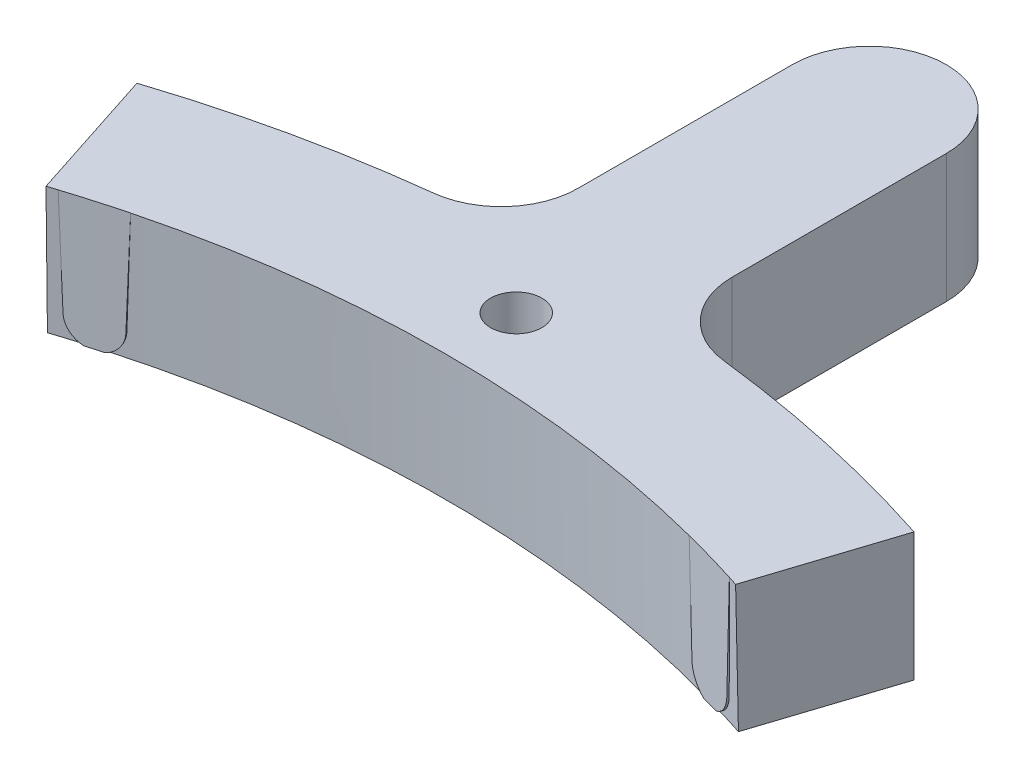
ISO-10303-21;
HEADER;
FILE_DESCRIPTION(('STEP AP214'),'2;1');
FILE_NAME('part.step','',(''),(''),'','','');
FILE_SCHEMA(('AUTOMOTIVE_DESIGN { 1 0 10303 214 1 1 1 1 }'));
ENDSEC;
DATA;
#1=APPLICATION_CONTEXT('core data for automotive mechanical design processes');
#2=APPLICATION_PROTOCOL_DEFINITION('international standard','automotive_design',2000,#1);
#3=PRODUCT_CONTEXT('',#1,'mechanical');
#4=PRODUCT('Part','Part','',(#3));
#5=PRODUCT_RELATED_PRODUCT_CATEGORY('part','',(#4));
#6=PRODUCT_DEFINITION_FORMATION('','',#4);
#7=PRODUCT_DEFINITION_CONTEXT('part definition',#1,'design');
#8=PRODUCT_DEFINITION('design','',#6,#7);
#9=PRODUCT_DEFINITION_SHAPE('','',#8);
#10=(LENGTH_UNIT() NAMED_UNIT(*) SI_UNIT(.MILLI.,.METRE.));
#11=(NAMED_UNIT(*) PLANE_ANGLE_UNIT() SI_UNIT($,.RADIAN.));
#12=(NAMED_UNIT(*) SI_UNIT($,.STERADIAN.) SOLID_ANGLE_UNIT());
#13=UNCERTAINTY_MEASURE_WITH_UNIT(LENGTH_MEASURE(1.E-05),#10,'distance_accuracy_value','');
#14=(GEOMETRIC_REPRESENTATION_CONTEXT(3) GLOBAL_UNCERTAINTY_ASSIGNED_CONTEXT((#13)) GLOBAL_UNIT_ASSIGNED_CONTEXT((#10,
#11,#12)) REPRESENTATION_CONTEXT('',''));
#15=CARTESIAN_POINT('',(0.,0.,0.));
#16=DIRECTION('',(0.,0.,1.));
#17=DIRECTION('',(1.,0.,0.));
#18=AXIS2_PLACEMENT_3D('',#15,#16,#17);
#19=CARTESIAN_POINT('',(0.,13.97,0.));
#20=DIRECTION('',(0.,-1.,0.));
#21=DIRECTION('',(0.,0.,-1.));
#22=AXIS2_PLACEMENT_3D('',#19,#20,#21);
#23=CYLINDRICAL_SURFACE('',#22,62.23);
#24=DIRECTION('',(0.,1.,0.));
#25=VECTOR('',#24,1.);
#26=CARTESIAN_POINT('',(-7.18038461538461,-15.5600139092241,-61.8143589853939));
#27=LINE('',#26,#25);
#28=CARTESIAN_POINT('',(-7.18038461538461,7.62,-61.8143589853939));
#29=VERTEX_POINT('',#28);
#30=CARTESIAN_POINT('',(-7.18038461538461,13.97,-61.8143589853939));
#31=VERTEX_POINT('',#30);
#32=EDGE_CURVE('E222',#29,#31,#27,.T.);
#33=ORIENTED_EDGE('',*,*,#32,.F.);
#34=CARTESIAN_POINT('',(0.,7.62,0.));
#35=DIRECTION('',(0.,1.,0.));
#36=DIRECTION('',(0.,0.,1.));
#37=AXIS2_PLACEMENT_3D('',#34,#35,#36);
#38=CIRCLE('',#37,62.23);
#39=CARTESIAN_POINT('',(-19.230127559953,7.61999999999723,-59.1842470090474));
#40=VERTEX_POINT('',#39);
#41=EDGE_CURVE('E346',#29,#40,#38,.T.);
#42=ORIENTED_EDGE('',*,*,#41,.T.);
#43=DIRECTION('',(0.,1.,0.));
#44=VECTOR('',#43,1.);
#45=CARTESIAN_POINT('',(-19.230127559953,7.61999999999723,-59.1842470090474));
#46=LINE('',#45,#44);
#47=CARTESIAN_POINT('',(-19.230127559953,13.97,-59.1842470090474));
#48=VERTEX_POINT('',#47);
#49=EDGE_CURVE('E235',#40,#48,#46,.T.);
#50=ORIENTED_EDGE('',*,*,#49,.T.);
#51=CARTESIAN_POINT('',(0.,13.97,0.));
#52=DIRECTION('',(0.,1.,0.));
#53=DIRECTION('',(0.,0.,1.));
#54=AXIS2_PLACEMENT_3D('',#51,#52,#53);
#55=CIRCLE('',#54,62.23);
#56=EDGE_CURVE('E64',#31,#48,#55,.T.);
#57=ORIENTED_EDGE('',*,*,#56,.F.);
#58=EDGE_LOOP('',(#33,#42,#50,#57));
#59=FACE_BOUND('',#58,.T.);
#60=ADVANCED_FACE('F41',(#59),#23,.T.);
#61=CARTESIAN_POINT('',(0.,13.97,0.));
#62=DIRECTION('',(0.,1.,0.));
#63=DIRECTION('',(0.,0.,1.));
#64=AXIS2_PLACEMENT_3D('',#61,#62,#63);
#65=PLANE('',#64);
#66=DIRECTION('',(-0.309016994374948,0.,0.951056516295153));
#67=VECTOR('',#66,1.);
#68=CARTESIAN_POINT('',(17.0643024179482,13.97,-52.518522625099));
#69=LINE('',#68,#67);
#70=CARTESIAN_POINT('',(19.2301275599531,13.97,-59.1842470090474));
#71=VERTEX_POINT('',#70);
#72=CARTESIAN_POINT('',(17.0643024179489,13.97,-52.5185226251009));
#73=VERTEX_POINT('',#72);
#74=EDGE_CURVE('E232',#71,#73,#69,.T.);
#75=ORIENTED_EDGE('',*,*,#74,.F.);
#76=CARTESIAN_POINT('',(7.1803846153846,13.97,-61.8143589853939));
#77=VERTEX_POINT('',#76);
#78=EDGE_CURVE('E348',#71,#77,#55,.T.);
#79=ORIENTED_EDGE('',*,*,#78,.T.);
#80=CARTESIAN_POINT('',(7.62,13.97,-65.5989115763364));
#81=DIRECTION('',(0.,-1.,0.));
#82=DIRECTION('',(0.,0.,-1.));
#83=AXIS2_PLACEMENT_3D('',#80,#81,#82);
#84=CIRCLE('',#83,3.81);
#85=CARTESIAN_POINT('',(3.81,13.97,-65.5989115763364));
#86=VERTEX_POINT('',#85);
#87=EDGE_CURVE('E212',#77,#86,#84,.T.);
#88=ORIENTED_EDGE('',*,*,#87,.T.);
#89=DIRECTION('',(0.,0.,-1.));
#90=VECTOR('',#89,1.);
#91=CARTESIAN_POINT('',(3.81,13.97,-65.5989115763364));
#92=LINE('',#91,#90);
#93=CARTESIAN_POINT('',(3.81,13.97,-76.2));
#94=VERTEX_POINT('',#93);
#95=EDGE_CURVE('E191',#86,#94,#92,.T.);
#96=ORIENTED_EDGE('',*,*,#95,.T.);
#97=CARTESIAN_POINT('',(0.,13.97,-76.2));
#98=DIRECTION('',(0.,1.,0.));
#99=DIRECTION('',(0.,0.,-1.));
#100=AXIS2_PLACEMENT_3D('',#97,#98,#99);
#101=CIRCLE('',#100,3.81);
#102=CARTESIAN_POINT('',(-3.81,13.97,-76.2));
#103=VERTEX_POINT('',#102);
#104=EDGE_CURVE('E185',#94,#103,#101,.T.);
#105=ORIENTED_EDGE('',*,*,#104,.T.);
#106=DIRECTION('',(0.,0.,1.));
#107=VECTOR('',#106,1.);
#108=CARTESIAN_POINT('',(-3.81,13.97,-65.5989115763364));
#109=LINE('',#108,#107);
#110=CARTESIAN_POINT('',(-3.81,13.97,-65.5989115763364));
#111=VERTEX_POINT('',#110);
#112=EDGE_CURVE('E194',#103,#111,#109,.T.);
#113=ORIENTED_EDGE('',*,*,#112,.T.);
#114=CARTESIAN_POINT('',(-7.62,13.97,-65.5989115763364));
#115=DIRECTION('',(0.,-1.,0.));
#116=DIRECTION('',(0.,0.,1.));
#117=AXIS2_PLACEMENT_3D('',#114,#115,#116);
#118=CIRCLE('',#117,3.81);
#119=EDGE_CURVE('E200',#111,#31,#118,.T.);
#120=ORIENTED_EDGE('',*,*,#119,.T.);
#121=ORIENTED_EDGE('',*,*,#56,.T.);
#122=DIRECTION('',(-0.309016994374949,0.,-0.951056516295153));
#123=VECTOR('',#122,1.);
#124=CARTESIAN_POINT('',(-17.0643024179482,13.97,-52.5185226250989));
#125=LINE('',#124,#123);
#126=CARTESIAN_POINT('',(-17.0643024179482,13.97,-52.5185226250989));
#127=VERTEX_POINT('',#126);
#128=EDGE_CURVE('E227',#127,#48,#125,.T.);
#129=ORIENTED_EDGE('',*,*,#128,.F.);
#130=CARTESIAN_POINT('',(0.,13.97,0.));
#131=DIRECTION('',(0.,1.,0.));
#132=DIRECTION('',(0.,0.,1.));
#133=AXIS2_PLACEMENT_3D('',#130,#131,#132);
#134=CIRCLE('',#133,55.2212426130964);
#135=CARTESIAN_POINT('',(-16.6079007781591,13.97,-52.664630137095));
#136=VERTEX_POINT('',#135);
#137=EDGE_CURVE('E344',#127,#136,#134,.F.);
#138=ORIENTED_EDGE('',*,*,#137,.T.);
#139=CARTESIAN_POINT('',(0.,13.97,0.));
#140=DIRECTION('',(0.,1.,0.));
#141=DIRECTION('',(0.,0.,1.));
#142=AXIS2_PLACEMENT_3D('',#139,#140,#141);
#143=CIRCLE('',#142,55.2212426130944);
#144=CARTESIAN_POINT('',(-13.8218889362057,13.97,-53.463455013396));
#145=VERTEX_POINT('',#144);
#146=EDGE_CURVE('E241',#145,#136,#143,.T.);
#147=ORIENTED_EDGE('',*,*,#146,.F.);
#148=CARTESIAN_POINT('',(13.8218889362064,13.97,-53.4634550133959));
#149=VERTEX_POINT('',#148);
#150=EDGE_CURVE('E347',#145,#149,#134,.F.);
#151=ORIENTED_EDGE('',*,*,#150,.T.);
#152=CARTESIAN_POINT('',(16.60790077816,13.97,-52.6646301370951));
#153=VERTEX_POINT('',#152);
#154=EDGE_CURVE('E247',#153,#149,#143,.T.);
#155=ORIENTED_EDGE('',*,*,#154,.F.);
#156=EDGE_CURVE('E340',#153,#73,#134,.F.);
#157=ORIENTED_EDGE('',*,*,#156,.T.);
#158=EDGE_LOOP('',(#75,#79,#88,#96,#105,#113,#120,#121,#129,#138,#147,#151,#155,#157));
#159=FACE_BOUND('',#158,.T.);
#160=CARTESIAN_POINT('',(0.,13.97,-58.7256213065478));
#161=DIRECTION('',(0.,1.,0.));
#162=DIRECTION('',(0.,0.,1.));
#163=AXIS2_PLACEMENT_3D('',#160,#161,#162);
#164=CIRCLE('',#163,1.27);
#165=CARTESIAN_POINT('',(0.,13.97,-57.4556213065478));
#166=VERTEX_POINT('',#165);
#167=EDGE_CURVE('E297',#166,#166,#164,.T.);
#168=ORIENTED_EDGE('',*,*,#167,.F.);
#169=EDGE_LOOP('',(#168));
#170=FACE_BOUND('',#169,.T.);
#171=ADVANCED_FACE('F203',(#159,#170),#65,.T.);
#172=CARTESIAN_POINT('',(0.,7.62,0.));
#173=DIRECTION('',(0.,1.,0.));
#174=DIRECTION('',(0.,0.,1.));
#175=AXIS2_PLACEMENT_3D('',#172,#173,#174);
#176=PLANE('',#175);
#177=CARTESIAN_POINT('',(0.,7.61999999999723,-58.7256213065478));
#178=DIRECTION('',(0.,1.,0.));
#179=DIRECTION('',(0.,0.,1.));
#180=AXIS2_PLACEMENT_3D('',#177,#178,#179);
#181=CIRCLE('',#180,1.27);
#182=CARTESIAN_POINT('',(0.,7.61999999999723,-57.4556213065478));
#183=VERTEX_POINT('',#182);
#184=EDGE_CURVE('E298',#183,#183,#181,.T.);
#185=ORIENTED_EDGE('',*,*,#184,.T.);
#186=EDGE_LOOP('',(#185));
#187=FACE_BOUND('',#186,.T.);
#188=CARTESIAN_POINT('',(19.2301275599531,7.61999999999723,-59.1842470090474));
#189=VERTEX_POINT('',#188);
#190=CARTESIAN_POINT('',(7.18038461538461,7.62,-61.8143589853939));
#191=VERTEX_POINT('',#190);
#192=EDGE_CURVE('E56',#189,#191,#38,.T.);
#193=ORIENTED_EDGE('',*,*,#192,.F.);
#194=DIRECTION('',(-0.309016994374948,0.,0.951056516295153));
#195=VECTOR('',#194,1.);
#196=CARTESIAN_POINT('',(17.0643024179482,7.61999999999723,-52.518522625099));
#197=LINE('',#196,#195);
#198=CARTESIAN_POINT('',(17.0985537572486,7.61999999999723,-52.6239374081898));
#199=VERTEX_POINT('',#198);
#200=EDGE_CURVE('E231',#189,#199,#197,.T.);
#201=ORIENTED_EDGE('',*,*,#200,.T.);
#202=CARTESIAN_POINT('',(0.,7.62,0.));
#203=DIRECTION('',(0.,1.,0.));
#204=DIRECTION('',(0.,0.,1.));
#205=AXIS2_PLACEMENT_3D('',#202,#203,#204);
#206=CIRCLE('',#205,55.3320822753905);
#207=CARTESIAN_POINT('',(15.6779541258353,7.62,-53.064499275493));
#208=VERTEX_POINT('',#207);
#209=EDGE_CURVE('E357',#208,#199,#206,.F.);
#210=ORIENTED_EDGE('',*,*,#209,.F.);
#211=DIRECTION('',(0.3826834323651,0.,-0.923879532511283));
#212=VECTOR('',#211,1.);
#213=CARTESIAN_POINT('',(-33.1291627373138,7.62,64.7663041958463));
#214=LINE('',#213,#212);
#215=CARTESIAN_POINT('',(15.6353003480636,7.61999999999723,-52.9615239467301));
#216=VERTEX_POINT('',#215);
#217=EDGE_CURVE('E363',#216,#208,#214,.T.);
#218=ORIENTED_EDGE('',*,*,#217,.F.);
#219=CARTESIAN_POINT('',(0.,7.61999999999723,0.));
#220=DIRECTION('',(0.,1.,0.));
#221=DIRECTION('',(0.,0.,1.));
#222=AXIS2_PLACEMENT_3D('',#219,#220,#221);
#223=CIRCLE('',#222,55.2212426130944);
#224=CARTESIAN_POINT('',(14.8078469408795,7.61999999999723,-53.1988092414644));
#225=VERTEX_POINT('',#224);
#226=EDGE_CURVE('E246',#216,#225,#223,.T.);
#227=ORIENTED_EDGE('',*,*,#226,.T.);
#228=DIRECTION('',(0.3826834323651,0.,-0.923879532511283));
#229=VECTOR('',#228,1.);
#230=CARTESIAN_POINT('',(-33.919331419079,7.62,64.4390056112967));
#231=LINE('',#230,#229);
#232=CARTESIAN_POINT('',(14.8505763772582,7.62,-53.3019672263023));
#233=VERTEX_POINT('',#232);
#234=EDGE_CURVE('E351',#233,#225,#231,.F.);
#235=ORIENTED_EDGE('',*,*,#234,.F.);
#236=CARTESIAN_POINT('',(-14.8505763772574,7.62,-53.3019672263026));
#237=VERTEX_POINT('',#236);
#238=EDGE_CURVE('E358',#237,#233,#206,.F.);
#239=ORIENTED_EDGE('',*,*,#238,.F.);
#240=DIRECTION('',(0.382683432365087,0.,0.923879532511288));
#241=VECTOR('',#240,1.);
#242=CARTESIAN_POINT('',(-21.5806685809216,7.62,-69.54984710041));
#243=LINE('',#242,#241);
#244=CARTESIAN_POINT('',(-14.8078469408787,7.61999999999723,-53.1988092414646));
#245=VERTEX_POINT('',#244);
#246=EDGE_CURVE('E361',#245,#237,#243,.F.);
#247=ORIENTED_EDGE('',*,*,#246,.F.);
#248=CARTESIAN_POINT('',(-15.635300348063,7.61999999999723,-52.9615239467303));
#249=VERTEX_POINT('',#248);
#250=EDGE_CURVE('E243',#245,#249,#223,.T.);
#251=ORIENTED_EDGE('',*,*,#250,.T.);
#252=DIRECTION('',(0.382683432365087,0.,0.923879532511288));
#253=VECTOR('',#252,1.);
#254=CARTESIAN_POINT('',(-22.3708372626869,7.62,-69.2225485158603));
#255=LINE('',#254,#253);
#256=CARTESIAN_POINT('',(-15.6779541258346,7.62,-53.0644992754932));
#257=VERTEX_POINT('',#256);
#258=EDGE_CURVE('E356',#257,#249,#255,.T.);
#259=ORIENTED_EDGE('',*,*,#258,.F.);
#260=CARTESIAN_POINT('',(-17.0985537572485,7.62,-52.6239374081897));
#261=VERTEX_POINT('',#260);
#262=EDGE_CURVE('E353',#261,#257,#206,.F.);
#263=ORIENTED_EDGE('',*,*,#262,.F.);
#264=DIRECTION('',(-0.309016994374949,0.,-0.951056516295153));
#265=VECTOR('',#264,1.);
#266=CARTESIAN_POINT('',(-17.0643024179482,7.61999999999723,-52.5185226250989));
#267=LINE('',#266,#265);
#268=EDGE_CURVE('E228',#261,#40,#267,.T.);
#269=ORIENTED_EDGE('',*,*,#268,.T.);
#270=ORIENTED_EDGE('',*,*,#41,.F.);
#271=CARTESIAN_POINT('',(-7.62,7.62,-65.5989115763364));
#272=DIRECTION('',(0.,1.,0.));
#273=DIRECTION('',(0.,0.,1.));
#274=AXIS2_PLACEMENT_3D('',#271,#272,#273);
#275=CIRCLE('',#274,3.81);
#276=CARTESIAN_POINT('',(-3.81,7.62,-65.5989115763364));
#277=VERTEX_POINT('',#276);
#278=EDGE_CURVE('E217',#29,#277,#275,.T.);
#279=ORIENTED_EDGE('',*,*,#278,.T.);
#280=DIRECTION('',(0.,0.,-1.));
#281=VECTOR('',#280,1.);
#282=CARTESIAN_POINT('',(-3.81,7.62,-65.5989115763364));
#283=LINE('',#282,#281);
#284=CARTESIAN_POINT('',(-3.81,7.62,-76.2));
#285=VERTEX_POINT('',#284);
#286=EDGE_CURVE('E225',#277,#285,#283,.T.);
#287=ORIENTED_EDGE('',*,*,#286,.T.);
#288=CARTESIAN_POINT('',(0.,7.62,-76.2));
#289=DIRECTION('',(0.,1.,0.));
#290=DIRECTION('',(0.,0.,1.));
#291=AXIS2_PLACEMENT_3D('',#288,#289,#290);
#292=CIRCLE('',#291,3.81);
#293=CARTESIAN_POINT('',(3.81,7.62,-76.2));
#294=VERTEX_POINT('',#293);
#295=EDGE_CURVE('E187',#285,#294,#292,.F.);
#296=ORIENTED_EDGE('',*,*,#295,.T.);
#297=DIRECTION('',(0.,0.,1.));
#298=VECTOR('',#297,1.);
#299=CARTESIAN_POINT('',(3.81,7.62,-65.5989115763364));
#300=LINE('',#299,#298);
#301=CARTESIAN_POINT('',(3.81,7.62,-65.5989115763364));
#302=VERTEX_POINT('',#301);
#303=EDGE_CURVE('E643',#294,#302,#300,.T.);
#304=ORIENTED_EDGE('',*,*,#303,.T.);
#305=CARTESIAN_POINT('',(7.62,7.62,-65.5989115763364));
#306=DIRECTION('',(0.,1.,0.));
#307=DIRECTION('',(0.,0.,1.));
#308=AXIS2_PLACEMENT_3D('',#305,#306,#307);
#309=CIRCLE('',#308,3.81);
#310=EDGE_CURVE('E641',#302,#191,#309,.T.);
#311=ORIENTED_EDGE('',*,*,#310,.T.);
#312=EDGE_LOOP('',(#193,#201,#210,#218,#227,#235,#239,#247,#251,#259,#263,#269,#270,#279,#287,
#296,#304,#311));
#313=FACE_BOUND('',#312,.T.);
#314=ADVANCED_FACE('F420',(#187,#313),#176,.F.);
#315=ORIENTED_EDGE('',*,*,#192,.T.);
#316=DIRECTION('',(0.,1.,0.));
#317=VECTOR('',#316,1.);
#318=CARTESIAN_POINT('',(7.1803846153846,-15.5600139092241,-61.8143589853939));
#319=LINE('',#318,#317);
#320=EDGE_CURVE('E220',#191,#77,#319,.T.);
#321=ORIENTED_EDGE('',*,*,#320,.T.);
#322=ORIENTED_EDGE('',*,*,#78,.F.);
#323=DIRECTION('',(0.,1.,0.));
#324=VECTOR('',#323,1.);
#325=CARTESIAN_POINT('',(19.2301275599531,7.61999999999723,-59.1842470090474));
#326=LINE('',#325,#324);
#327=EDGE_CURVE('E239',#189,#71,#326,.T.);
#328=ORIENTED_EDGE('',*,*,#327,.F.);
#329=EDGE_LOOP('',(#315,#321,#322,#328));
#330=FACE_BOUND('',#329,.T.);
#331=ADVANCED_FACE('F43',(#330),#23,.T.);
#332=CARTESIAN_POINT('',(-33.5242470781964,8.79545454545456,64.6026549035715));
#333=DIRECTION('',(0.3826834323651,0.,-0.923879532511283));
#334=DIRECTION('',(-0.923879532511283,0.,-0.3826834323651));
#335=AXIS2_PLACEMENT_3D('',#332,#333,#334);
#336=CYLINDRICAL_SURFACE('',#335,1.25082617325609);
#337=CARTESIAN_POINT('',(14.0073445921701,8.75000000000001,-53.4151657603946));
#338=CARTESIAN_POINT('',(14.0085858806633,8.7150372578908,-53.4148400515819));
#339=CARTESIAN_POINT('',(14.0112596144098,8.68014579445324,-53.414139077835));
#340=CARTESIAN_POINT('',(14.0194466709025,8.61072336649007,-53.4119909095694));
#341=CARTESIAN_POINT('',(14.0249597906874,8.57619237637754,-53.4105437683873));
#342=CARTESIAN_POINT('',(14.0456942180024,8.47359130266056,-53.4050964045974));
#343=CARTESIAN_POINT('',(14.0651155856845,8.40637688068924,-53.399988949725));
#344=CARTESIAN_POINT('',(14.11456783142,8.27628584698632,-53.3869390210942));
#345=CARTESIAN_POINT('',(14.144601688574,8.21341045922316,-53.3789957512692));
#346=CARTESIAN_POINT('',(14.2143841408578,8.09372130083178,-53.3604555575765));
#347=CARTESIAN_POINT('',(14.2541332399715,8.03690784488959,-53.3498584960409));
#348=CARTESIAN_POINT('',(14.3423928192044,7.93064758724991,-53.32619898783));
#349=CARTESIAN_POINT('',(14.3909473895875,7.88124025293369,-53.313124118881));
#350=CARTESIAN_POINT('',(14.4952704394404,7.79150136182203,-53.2848541100855));
#351=CARTESIAN_POINT('',(14.5510344453378,7.75116421899152,-53.2696602846297));
#352=CARTESIAN_POINT('',(14.6411881996761,7.69687222021444,-53.2449276838377));
#353=CARTESIAN_POINT('',(14.6736262018866,7.679311208585,-53.2359982161891));
#354=CARTESIAN_POINT('',(14.7398062527615,7.64730710703177,-53.217712541893));
#355=CARTESIAN_POINT('',(14.7735455927254,7.6328579134935,-53.2083572150404));
#356=CARTESIAN_POINT('',(14.8078469408721,7.62,-53.1988092414664));
#357=B_SPLINE_CURVE_WITH_KNOTS('',3,(#337,#338,#339,#340,#341,#342,#343,#344,#345,#346,#347,
#348,#349,#350,#351,#352,#353,#354,#355,#356),.UNSPECIFIED.,.F.,.F.,(4,2,2,2,2,2,2,2,2,4),(0.,
0.104893941616141,0.209780386380559,0.419149511561035,0.628577456855517,0.838016268655771,
1.04853427706666,1.25892227702113,1.37264268617751,1.48613796713562),.UNSPECIFIED.);
#358=CARTESIAN_POINT('',(14.0073445921701,8.75000000000001,-53.4151657603946));
#359=VERTEX_POINT('',#358);
#360=EDGE_CURVE('E292',#359,#225,#357,.T.);
#361=ORIENTED_EDGE('',*,*,#360,.F.);
#362=DIRECTION('',(0.3826834323651,0.,-0.923879532511283));
#363=VECTOR('',#362,1.);
#364=CARTESIAN_POINT('',(-34.6790964938355,8.75000000000001,64.1243006131152));
#365=LINE('',#364,#363);
#366=CARTESIAN_POINT('',(14.0425385319295,8.75000000000001,-53.5001314470751));
#367=VERTEX_POINT('',#366);
#368=EDGE_CURVE('E403',#359,#367,#365,.T.);
#369=ORIENTED_EDGE('',*,*,#368,.T.);
#370=CARTESIAN_POINT('',(14.0425300991448,8.75020000000001,-53.500130051219));
#371=CARTESIAN_POINT('',(14.0440043830292,8.71516909788636,-53.5003750656353));
#372=CARTESIAN_POINT('',(14.0469159413991,8.68021313264552,-53.5002418450554));
#373=CARTESIAN_POINT('',(14.0555849784431,8.61066997333142,-53.4992201249084));
#374=CARTESIAN_POINT('',(14.0613422217293,8.57608274899854,-53.4983316878066));
#375=CARTESIAN_POINT('',(14.0828124322474,8.47332700541943,-53.4945402204686));
#376=CARTESIAN_POINT('',(14.1027298483321,8.40602667464791,-53.4905119710336));
#377=CARTESIAN_POINT('',(14.1531617751541,8.27579448185234,-53.479541546184));
#378=CARTESIAN_POINT('',(14.1836794276706,8.21286392161697,-53.4725985067344));
#379=CARTESIAN_POINT('',(14.2543917342782,8.09309963783291,-53.4559553654461));
#380=CARTESIAN_POINT('',(14.2945856083862,8.03626542340202,-53.4462554858202));
#381=CARTESIAN_POINT('',(14.3837336620337,7.92993874686785,-53.4242546439578));
#382=CARTESIAN_POINT('',(14.4327381085903,7.88049156051501,-53.4119386788795));
#383=CARTESIAN_POINT('',(14.5379325824699,7.79068177316544,-53.3850269146282));
#384=CARTESIAN_POINT('',(14.5941238639358,7.75032076115794,-53.3704307174432));
#385=CARTESIAN_POINT('',(14.7125809492409,7.67949520635115,-53.3391802075512));
#386=CARTESIAN_POINT('',(14.7748933243814,7.64911563359471,-53.3225098096182));
#387=CARTESIAN_POINT('',(14.9034165586518,7.5995591747543,-53.2876291305548));
#388=CARTESIAN_POINT('',(14.9696273247672,7.58038202150285,-53.26941888616));
#389=CARTESIAN_POINT('',(15.1043486108792,7.55371802910582,-53.2318600447996));
#390=CARTESIAN_POINT('',(15.1728672915426,7.54627839878656,-53.2125071739948));
#391=CARTESIAN_POINT('',(15.3099994073473,7.54346962530883,-53.1732655069904));
#392=CARTESIAN_POINT('',(15.378612841801,7.54810039502529,-53.1533767146602));
#393=CARTESIAN_POINT('',(15.5138536860846,7.56931297724383,-53.1136756632832));
#394=CARTESIAN_POINT('',(15.5804844532399,7.58587322990591,-53.0938633309029));
#395=CARTESIAN_POINT('',(15.70998537863,7.63048626068724,-53.0548773304123));
#396=CARTESIAN_POINT('',(15.7728553788987,7.6585395211675,-53.0357036891445));
#397=CARTESIAN_POINT('',(15.8926933018397,7.72518605788927,-52.9987015467957));
#398=CARTESIAN_POINT('',(15.9496913044603,7.76372151277316,-52.980866331906));
#399=CARTESIAN_POINT('',(16.0565254790056,7.85031288731863,-52.9470074234216));
#400=CARTESIAN_POINT('',(16.1063632880683,7.89836662468236,-52.9309833159066));
#401=CARTESIAN_POINT('',(16.1971874765541,8.00233290783669,-52.9013632326845));
#402=CARTESIAN_POINT('',(16.2382246246785,8.05819712816418,-52.8877534128999));
#403=CARTESIAN_POINT('',(16.3106613697346,8.17641164847895,-52.8632993728653));
#404=CARTESIAN_POINT('',(16.3420578207738,8.23876405678396,-52.8524560555581));
#405=CARTESIAN_POINT('',(16.3966270745131,8.37397713300818,-52.8330826802537));
#406=CARTESIAN_POINT('',(16.4188255157127,8.44727939667413,-52.8248424771447));
#407=CARTESIAN_POINT('',(16.4421886524191,8.5595188875034,-52.8155211323068));
#408=CARTESIAN_POINT('',(16.448322223077,8.59736833303618,-52.8129189887007));
#409=CARTESIAN_POINT('',(16.457225774507,8.67351691739335,-52.8087528577866));
#410=CARTESIAN_POINT('',(16.4599957975567,8.71181605055932,-52.8071888574299));
#411=CARTESIAN_POINT('',(16.4610712347174,8.75020000000001,-52.8061521121194));
#412=B_SPLINE_CURVE_WITH_KNOTS('',3,(#370,#371,#372,#373,#374,#375,#376,#377,#378,#379,#380,
#381,#382,#383,#384,#385,#386,#387,#388,#389,#390,#391,#392,#393,#394,#395,#396,#397,#398,#399,
#400,#401,#402,#403,#404,#405,#406,#407,#408,#409,#410,#411),.UNSPECIFIED.,.F.,.F.,(4,2,2,2,2,2,
2,2,2,2,2,2,2,2,2,2,2,2,2,2,4),(0.,0.10512297837038,0.210237262688619,0.420057511205394,
0.629940000991473,0.839805578180826,1.05090886494074,1.26204904079263,1.47494265677796,
1.68783119523739,1.90157381749158,2.11531489693933,2.32867065379797,2.54203536610563,
2.75424619233465,2.96640842026933,3.17731169746361,3.38828372235044,3.61793693203064,
3.73309037366495,3.84824236787698),.UNSPECIFIED.);
#413=EDGE_CURVE('E314',#367,#233,#412,.T.);
#414=ORIENTED_EDGE('',*,*,#413,.T.);
#415=ORIENTED_EDGE('',*,*,#234,.T.);
#416=EDGE_LOOP('',(#361,#369,#414,#415));
#417=FACE_BOUND('',#416,.T.);
#418=ADVANCED_FACE('F307',(#417),#336,.T.);
#419=CARTESIAN_POINT('',(-21.9757529218042,8.79545454545453,-69.3861978081352));
#420=DIRECTION('',(0.382683432365087,0.,0.923879532511288));
#421=DIRECTION('',(0.923879532511288,0.,-0.382683432365087));
#422=AXIS2_PLACEMENT_3D('',#419,#420,#421);
#423=CYLINDRICAL_SURFACE('',#422,1.25082617325609);
#424=CARTESIAN_POINT('',(-14.8078469408713,7.62,-53.1988092414666));
#425=CARTESIAN_POINT('',(-14.7756838966712,7.6320572379658,-53.2077619500282));
#426=CARTESIAN_POINT('',(-14.7440159455666,7.64551165998661,-53.2165450927578));
#427=CARTESIAN_POINT('',(-14.6818653223711,7.6751299337677,-53.2337252429379));
#428=CARTESIAN_POINT('',(-14.651382629257,7.69129373744397,-53.2421222572377));
#429=CARTESIAN_POINT('',(-14.5620821457307,7.74367633029445,-53.2666424443939));
#430=CARTESIAN_POINT('',(-14.5053258918278,7.78381863632469,-53.282118677676));
#431=CARTESIAN_POINT('',(-14.3990873741496,7.87342279976067,-53.3109272338722));
#432=CARTESIAN_POINT('',(-14.3496089924755,7.9228895990951,-53.324258412943));
#433=CARTESIAN_POINT('',(-14.2593928938256,8.02976910437864,-53.348453908613));
#434=CARTESIAN_POINT('',(-14.2186542303345,8.08718094876699,-53.359318492353));
#435=CARTESIAN_POINT('',(-14.1473333615946,8.20801641317838,-53.3782723126086));
#436=CARTESIAN_POINT('',(-14.1167024863271,8.27140927686945,-53.3863748550562));
#437=CARTESIAN_POINT('',(-14.0662763216136,8.4026328834318,-53.3996834507452));
#438=CARTESIAN_POINT('',(-14.0464720960742,8.47045991450002,-53.4048918927759));
#439=CARTESIAN_POINT('',(-14.0253049389238,8.57414177359218,-53.4104531566337));
#440=CARTESIAN_POINT('',(-14.0196690658754,8.609117051183,-53.4119325449581));
#441=CARTESIAN_POINT('',(-14.0113191796764,8.67937104085393,-53.4141234571565));
#442=CARTESIAN_POINT('',(-14.0085996382034,8.71464905057889,-53.4148364338793));
#443=CARTESIAN_POINT('',(-14.0073445921693,8.74999999999996,-53.4151657603949));
#444=B_SPLINE_CURVE_WITH_KNOTS('',3,(#424,#425,#426,#427,#428,#429,#430,#431,#432,#433,#434,
#435,#436,#437,#438,#439,#440,#441,#442,#443),.UNSPECIFIED.,.F.,.F.,(4,2,2,2,2,2,2,2,2,4),(0.,
0.106424128352351,0.212846368171112,0.425409474226441,0.638085555900373,0.850738593023571,
1.06235221258833,1.27379090591384,1.38005011819985,1.48610754297878),.UNSPECIFIED.);
#445=CARTESIAN_POINT('',(-14.0073445921694,8.74999999999999,-53.4151657603948));
#446=VERTEX_POINT('',#445);
#447=EDGE_CURVE('E285',#245,#446,#444,.T.);
#448=ORIENTED_EDGE('',*,*,#447,.F.);
#449=ORIENTED_EDGE('',*,*,#246,.T.);
#450=CARTESIAN_POINT('',(-16.4610712347167,8.75019999999999,-52.8061521121197));
#451=CARTESIAN_POINT('',(-16.4600905078143,8.71517963462861,-52.8070979245941));
#452=CARTESIAN_POINT('',(-16.4576985977738,8.68022738790714,-52.8084827749623));
#453=CARTESIAN_POINT('',(-16.4501117982111,8.61067563326999,-52.8121182356361));
#454=CARTESIAN_POINT('',(-16.4449170421226,8.57607610864236,-52.8143688047265));
#455=CARTESIAN_POINT('',(-16.4251790128956,8.47323977459746,-52.8223919661006));
#456=CARTESIAN_POINT('',(-16.4064785943001,8.40584802502434,-52.8294392245966));
#457=CARTESIAN_POINT('',(-16.3585071194367,8.27537298304525,-52.8466971076784));
#458=CARTESIAN_POINT('',(-16.3292311413209,8.21229171301138,-52.8569092048599));
#459=CARTESIAN_POINT('',(-16.2609353763733,8.09222313263617,-52.8801522581684));
#460=CARTESIAN_POINT('',(-16.221917441028,8.03523466727595,-52.8931826786022));
#461=CARTESIAN_POINT('',(-16.1352046844452,7.9289137297511,-52.9216391588118));
#462=CARTESIAN_POINT('',(-16.0875036771451,7.87958676258297,-52.9370669253698));
#463=CARTESIAN_POINT('',(-15.984780587224,7.79000114749817,-52.9698088046234));
#464=CARTESIAN_POINT('',(-15.9297573070989,7.749743985788,-52.9871232257834));
#465=CARTESIAN_POINT('',(-15.8137439414525,7.67929242491844,-53.0231458554112));
#466=CARTESIAN_POINT('',(-15.7527341084356,7.64913288278495,-53.0418586246007));
#467=CARTESIAN_POINT('',(-15.6266272222995,7.59988165098044,-53.0800437913103));
#468=CARTESIAN_POINT('',(-15.561530285397,7.58078964676236,-53.0995161672249));
#469=CARTESIAN_POINT('',(-15.4286926936625,7.55409383310843,-53.1387513996401));
#470=CARTESIAN_POINT('',(-15.3609392038934,7.54655539422041,-53.1585152748599));
#471=CARTESIAN_POINT('',(-15.2250407522429,7.54335118078132,-53.1976552498967));
#472=CARTESIAN_POINT('',(-15.1568957773398,7.54768580346682,-53.2170313367176));
#473=CARTESIAN_POINT('',(-15.0217342029901,7.56814323836211,-53.2549711935823));
#474=CARTESIAN_POINT('',(-14.9547263455002,7.58433369398062,-53.2735296517743));
#475=CARTESIAN_POINT('',(-14.8241379554144,7.6281167133218,-53.3092221857257));
#476=CARTESIAN_POINT('',(-14.7605577313797,7.65571030164218,-53.3263561333232));
#477=CARTESIAN_POINT('',(-14.6384698200705,7.72162461948306,-53.3588065394016));
#478=CARTESIAN_POINT('',(-14.5799768900549,7.75997527710421,-53.3741177549551));
#479=CARTESIAN_POINT('',(-14.4699731329718,7.84629548292981,-53.4024842995067));
#480=CARTESIAN_POINT('',(-14.418461010013,7.89426324174035,-53.4155400473257));
#481=CARTESIAN_POINT('',(-14.3240644463604,7.99833931633366,-53.4390502900073));
#482=CARTESIAN_POINT('',(-14.281155593086,8.05442379741197,-53.4495121657989));
#483=CARTESIAN_POINT('',(-14.2050669377344,8.17325191831641,-53.4676382405412));
#484=CARTESIAN_POINT('',(-14.1718893354908,8.23599705948321,-53.4753018070056));
#485=CARTESIAN_POINT('',(-14.1139506269104,8.37192035232434,-53.4881708156782));
#486=CARTESIAN_POINT('',(-14.0901327108415,8.44553212948978,-53.4931151381989));
#487=CARTESIAN_POINT('',(-14.0645673196866,8.55834495436559,-53.4978042365863));
#488=CARTESIAN_POINT('',(-14.0577363864202,8.59641052959647,-53.4989122870973));
#489=CARTESIAN_POINT('',(-14.0475309479572,8.67301928062934,-53.50021024077));
#490=CARTESIAN_POINT('',(-14.0441565838154,8.71156247585699,-53.5004001064636));
#491=CARTESIAN_POINT('',(-14.0425300991441,8.75019999999999,-53.5001300512192));
#492=B_SPLINE_CURVE_WITH_KNOTS('',3,(#450,#451,#452,#453,#454,#455,#456,#457,#458,#459,#460,
#461,#462,#463,#464,#465,#466,#467,#468,#469,#470,#471,#472,#473,#474,#475,#476,#477,#478,#479,
#480,#481,#482,#483,#484,#485,#486,#487,#488,#489,#490,#491),.UNSPECIFIED.,.F.,.F.,(4,2,2,2,2,2,
2,2,2,2,2,2,2,2,2,2,2,2,2,2,4),(0.,0.105076078827557,0.210147155797917,0.41994197163866,
0.629834551697275,0.839687271399393,1.04969008535876,1.25972728604374,1.47048223520751,
1.68123119427663,1.89316823401771,2.10511236461504,2.3182752576049,2.53145730793721,
2.74523845459077,2.95897986117606,3.17210589473798,3.38528007021831,3.6163929158136,
3.73231659165213,3.84824499788819),.UNSPECIFIED.);
#493=CARTESIAN_POINT('',(-14.0425385319279,8.74999999999999,-53.5001314470732));
#494=VERTEX_POINT('',#493);
#495=EDGE_CURVE('E341',#237,#494,#492,.T.);
#496=ORIENTED_EDGE('',*,*,#495,.T.);
#497=DIRECTION('',(0.382683432365087,0.,0.923879532511288));
#498=VECTOR('',#497,1.);
#499=CARTESIAN_POINT('',(-20.8209035061651,8.74999999999999,-69.8645520985915));
#500=LINE('',#499,#498);
#501=EDGE_CURVE('E387',#494,#446,#500,.T.);
#502=ORIENTED_EDGE('',*,*,#501,.T.);
#503=EDGE_LOOP('',(#448,#449,#496,#502));
#504=FACE_BOUND('',#503,.T.);
#505=ADVANCED_FACE('F439',(#504),#423,.T.);
#506=CARTESIAN_POINT('',(0.,-2.,0.));
#507=DIRECTION('',(0.,-1.,0.));
#508=DIRECTION('',(0.,0.,-1.));
#509=AXIS2_PLACEMENT_3D('',#506,#507,#508);
#510=CONICAL_SURFACE('',#509,55.5,0.0174532925199433);
#511=CARTESIAN_POINT('',(-33.9484057910653,-1208.00096511678,14.0618900996045));
#512=DIRECTION('',(0.923269308182815,-0.036339618107143,-0.382430669172144));
#513=DIRECTION('',(-0.033573429388466,-0.999339497946432,0.0139065697880779));
#514=AXIS2_PLACEMENT_3D('',#511,#512,#513);
#515=ELLIPSE('',#514,2106.5390649924,67.1550282715827);
#516=EDGE_CURVE('E380',#494,#145,#515,.T.);
#517=ORIENTED_EDGE('',*,*,#516,.F.);
#518=ORIENTED_EDGE('',*,*,#495,.F.);
#519=ORIENTED_EDGE('',*,*,#238,.T.);
#520=ORIENTED_EDGE('',*,*,#413,.F.);
#521=CARTESIAN_POINT('',(33.9484057910696,-1208.00096511691,14.0618900996068));
#522=DIRECTION('',(-0.92326930818281,-0.036339618107143,-0.382430669172156));
#523=DIRECTION('',(0.0335734293884658,-0.999339497946432,0.0139065697880784));
#524=AXIS2_PLACEMENT_3D('',#521,#522,#523);
#525=ELLIPSE('',#524,2106.53906499263,67.1550282715864);
#526=EDGE_CURVE('E320',#149,#367,#525,.T.);
#527=ORIENTED_EDGE('',*,*,#526,.F.);
#528=ORIENTED_EDGE('',*,*,#150,.F.);
#529=EDGE_LOOP('',(#517,#518,#519,#520,#527,#528));
#530=FACE_BOUND('',#529,.T.);
#531=ADVANCED_FACE('F330',(#530),#510,.F.);
#532=CARTESIAN_POINT('',(-34.6790964938355,8.75000000000001,64.1243006131152));
#533=DIRECTION('',(-0.92326930818281,-0.036339618107143,-0.382430669172156));
#534=DIRECTION('',(-0.3826834323651,0.,0.923879532511283));
#535=AXIS2_PLACEMENT_3D('',#532,#533,#534);
#536=PLANE('',#535);
#537=CARTESIAN_POINT('',(0.,-197.5,0.));
#538=DIRECTION('',(-0.92326930818281,-0.036339618107143,-0.382430669172156));
#539=DIRECTION('',(-0.0335734293884658,0.999339497946432,-0.0139065697880784));
#540=AXIS2_PLACEMENT_3D('',#537,#538,#539);
#541=ELLIPSE('',#540,1519.58786276403,55.2212426130944);
#542=EDGE_CURVE('E290',#149,#359,#541,.T.);
#543=ORIENTED_EDGE('',*,*,#542,.F.);
#544=ORIENTED_EDGE('',*,*,#526,.T.);
#545=ORIENTED_EDGE('',*,*,#368,.F.);
#546=EDGE_LOOP('',(#543,#544,#545));
#547=FACE_BOUND('',#546,.T.);
#548=ADVANCED_FACE('F308',(#547),#536,.T.);
#549=CARTESIAN_POINT('',(-20.8209035061651,8.74999999999999,-69.8645520985915));
#550=DIRECTION('',(0.923269308182815,-0.036339618107143,-0.382430669172144));
#551=DIRECTION('',(-0.382683432365087,0.,-0.923879532511288));
#552=AXIS2_PLACEMENT_3D('',#549,#550,#551);
#553=PLANE('',#552);
#554=CARTESIAN_POINT('',(0.,-197.5,0.));
#555=DIRECTION('',(0.923269308182815,-0.036339618107143,-0.382430669172144));
#556=DIRECTION('',(0.033573429388466,0.999339497946432,-0.0139065697880779));
#557=AXIS2_PLACEMENT_3D('',#554,#555,#556);
#558=ELLIPSE('',#557,1519.58786276403,55.2212426130944);
#559=EDGE_CURVE('E291',#446,#145,#558,.T.);
#560=ORIENTED_EDGE('',*,*,#559,.F.);
#561=ORIENTED_EDGE('',*,*,#501,.F.);
#562=ORIENTED_EDGE('',*,*,#516,.T.);
#563=EDGE_LOOP('',(#560,#561,#562));
#564=FACE_BOUND('',#563,.T.);
#565=ADVANCED_FACE('F305',(#564),#553,.T.);
#566=CARTESIAN_POINT('',(15.635300348071,7.62,-52.961523946728));
#567=CARTESIAN_POINT('',(15.6671696004145,7.63202179418539,-52.9521156569578));
#568=CARTESIAN_POINT('',(15.6985307120969,7.64543448520233,-52.942825778538));
#569=CARTESIAN_POINT('',(15.7600464806844,7.67495765718257,-52.924546267543));
#570=CARTESIAN_POINT('',(15.7902011616465,7.6910680843181,-52.9155566289815));
#571=CARTESIAN_POINT('',(15.8784864808741,7.74327009451418,-52.8891582748382));
#572=CARTESIAN_POINT('',(15.9345322210885,7.78326788396927,-52.8722923794747));
#573=CARTESIAN_POINT('',(16.039345140958,7.87253430756342,-52.8405909857445));
#574=CARTESIAN_POINT('',(16.0881085015279,7.92180777572565,-52.8257565530705));
#575=CARTESIAN_POINT('',(16.1769672143099,8.02824458839257,-52.7986129457537));
#576=CARTESIAN_POINT('',(16.2170632967787,8.08540726753071,-52.7863035583692));
#577=CARTESIAN_POINT('',(16.2873191128334,8.20579047147102,-52.7646683323903));
#578=CARTESIAN_POINT('',(16.3175101661469,8.26899106961964,-52.7553330922952));
#579=CARTESIAN_POINT('',(16.3672588643499,8.39980224714892,-52.7399199591868));
#580=CARTESIAN_POINT('',(16.3868245597999,8.46740944413849,-52.7338396000839));
#581=CARTESIAN_POINT('',(16.4079568332965,8.57140173127765,-52.7272665731919));
#582=CARTESIAN_POINT('',(16.41364740108,8.60691895746261,-52.7254951530873));
#583=CARTESIAN_POINT('',(16.422067131534,8.67826659261429,-52.7228732274757));
#584=CARTESIAN_POINT('',(16.424802002802,8.7140962626514,-52.7220209467605));
#585=CARTESIAN_POINT('',(16.4260536723926,8.75000000000001,-52.7216312009208));
#586=B_SPLINE_CURVE_WITH_KNOTS('',3,(#566,#567,#568,#569,#570,#571,#572,#573,#574,#575,#576,
#577,#578,#579,#580,#581,#582,#583,#584,#585),.UNSPECIFIED.,.F.,.F.,(4,2,2,2,2,2,2,2,2,4),(0.,
0.105945927463777,0.211889741246635,0.423469102777343,0.635159035763832,0.846831125974042,
1.05782730881979,1.26866340144239,1.37658720319618,1.48430218761282),.UNSPECIFIED.);
#587=CARTESIAN_POINT('',(16.4260536723926,8.75000000000001,-52.7216312009208));
#588=VERTEX_POINT('',#587);
#589=EDGE_CURVE('E278',#216,#588,#586,.T.);
#590=ORIENTED_EDGE('',*,*,#589,.F.);
#591=ORIENTED_EDGE('',*,*,#217,.T.);
#592=CARTESIAN_POINT('',(16.4610656197773,8.75000000000001,-52.8061575191419));
#593=VERTEX_POINT('',#592);
#594=EDGE_CURVE('E321',#208,#593,#412,.T.);
#595=ORIENTED_EDGE('',*,*,#594,.T.);
#596=DIRECTION('',(0.3826834323651,0.,-0.923879532511283));
#597=VECTOR('',#596,1.);
#598=CARTESIAN_POINT('',(-32.3693976625573,8.75000000000001,65.0810091940279));
#599=LINE('',#598,#597);
#600=EDGE_CURVE('E322',#588,#593,#599,.T.);
#601=ORIENTED_EDGE('',*,*,#600,.F.);
#602=EDGE_LOOP('',(#590,#591,#595,#601));
#603=FACE_BOUND('',#602,.T.);
#604=ADVANCED_FACE('F300',(#603),#336,.T.);
#605=DIRECTION('',(0.00539309018185936,-0.999847695156391,-0.01659822486721));
#606=VECTOR('',#605,1.);
#607=CARTESIAN_POINT('',(0.,3177.59287050714,0.));
#608=LINE('',#607,#606);
#609=EDGE_CURVE('E11',#73,#199,#608,.T.);
#610=ORIENTED_EDGE('',*,*,#609,.F.);
#611=ORIENTED_EDGE('',*,*,#156,.F.);
#612=CARTESIAN_POINT('',(-30.4907929376113,-761.332402551025,-12.6296999622688));
#613=DIRECTION('',(0.92326930818281,-0.0363396181071431,0.382430669172156));
#614=DIRECTION('',(-0.0335734293884659,-0.999339497946432,-0.0139065697880785));
#615=AXIS2_PLACEMENT_3D('',#612,#613,#614);
#616=ELLIPSE('',#615,1891.99006400992,60.3153524896017);
#617=EDGE_CURVE('E391',#593,#153,#616,.T.);
#618=ORIENTED_EDGE('',*,*,#617,.F.);
#619=ORIENTED_EDGE('',*,*,#594,.F.);
#620=ORIENTED_EDGE('',*,*,#209,.T.);
#621=EDGE_LOOP('',(#610,#611,#618,#619,#620));
#622=FACE_BOUND('',#621,.T.);
#623=ADVANCED_FACE('F304',(#622),#510,.F.);
#624=CARTESIAN_POINT('',(-31.9074578963016,22.5,65.2723509102104));
#625=DIRECTION('',(0.92326930818281,-0.0363396181071431,0.382430669172156));
#626=DIRECTION('',(0.3826834323651,0.,-0.923879532511283));
#627=AXIS2_PLACEMENT_3D('',#624,#625,#626);
#628=PLANE('',#627);
#629=CARTESIAN_POINT('',(0.,146.249999999999,0.));
#630=DIRECTION('',(0.92326930818281,-0.0363396181071431,0.382430669172156));
#631=DIRECTION('',(0.0335734293884659,0.999339497946432,0.0139065697880785));
#632=AXIS2_PLACEMENT_3D('',#629,#630,#631);
#633=ELLIPSE('',#632,1519.58786276402,55.2212426130944);
#634=EDGE_CURVE('E257',#588,#153,#633,.T.);
#635=ORIENTED_EDGE('',*,*,#634,.F.);
#636=ORIENTED_EDGE('',*,*,#600,.T.);
#637=ORIENTED_EDGE('',*,*,#617,.T.);
#638=EDGE_LOOP('',(#635,#636,#637));
#639=FACE_BOUND('',#638,.T.);
#640=ADVANCED_FACE('F309',(#639),#628,.T.);
#641=DIRECTION('',(0.00539309018185937,0.999847695156392,0.01659822486721));
#642=VECTOR('',#641,1.);
#643=CARTESIAN_POINT('',(0.,3177.59287050714,0.));
#644=LINE('',#643,#642);
#645=EDGE_CURVE('E49',#261,#127,#644,.T.);
#646=ORIENTED_EDGE('',*,*,#645,.F.);
#647=ORIENTED_EDGE('',*,*,#262,.T.);
#648=CARTESIAN_POINT('',(-16.4610656197757,8.74999999999999,-52.80615751914));
#649=VERTEX_POINT('',#648);
#650=EDGE_CURVE('E333',#649,#257,#492,.T.);
#651=ORIENTED_EDGE('',*,*,#650,.F.);
#652=CARTESIAN_POINT('',(30.4907929376086,-761.332402550942,-12.6296999622672));
#653=DIRECTION('',(-0.923269308182815,-0.036339618107143,0.382430669172144));
#654=DIRECTION('',(0.033573429388466,-0.999339497946432,-0.0139065697880779));
#655=AXIS2_PLACEMENT_3D('',#652,#653,#654);
#656=ELLIPSE('',#655,1891.9900640097,60.3153524895981);
#657=EDGE_CURVE('E342',#136,#649,#656,.T.);
#658=ORIENTED_EDGE('',*,*,#657,.F.);
#659=ORIENTED_EDGE('',*,*,#137,.F.);
#660=EDGE_LOOP('',(#646,#647,#651,#658,#659));
#661=FACE_BOUND('',#660,.T.);
#662=ADVANCED_FACE('F325',(#661),#510,.F.);
#663=CARTESIAN_POINT('',(-16.4260536723919,8.74999999999999,-52.721631200921));
#664=CARTESIAN_POINT('',(-16.4248311549493,8.71493838694782,-52.7220118890075));
#665=CARTESIAN_POINT('',(-16.4221945967825,8.6799477325131,-52.7228335167382));
#666=CARTESIAN_POINT('',(-16.4141154665609,8.61032552679615,-52.7253494185936));
#667=CARTESIAN_POINT('',(-16.4086730466405,8.57569395614817,-52.7270436454057));
#668=CARTESIAN_POINT('',(-16.3881932833267,8.47277661278021,-52.7334141630707));
#669=CARTESIAN_POINT('',(-16.3689990430685,8.40534554746651,-52.7393796755141));
#670=CARTESIAN_POINT('',(-16.3200664904572,8.27482425768111,-52.7545421279577));
#671=CARTESIAN_POINT('',(-16.2903243565501,8.21173561639637,-52.7637402391336));
#672=CARTESIAN_POINT('',(-16.2211319421066,8.09165969151337,-52.7850529909469));
#673=CARTESIAN_POINT('',(-16.1816817843771,8.0346723307468,-52.7971675946907));
#674=CARTESIAN_POINT('',(-16.0941083997951,7.92830240489208,-52.8239283611752));
#675=CARTESIAN_POINT('',(-16.0459677381629,7.87893550411203,-52.8385796104389));
#676=CARTESIAN_POINT('',(-15.9424224599616,7.78932757125351,-52.8699131207797));
#677=CARTESIAN_POINT('',(-15.8870225893197,7.74908062324961,-52.8865940543849));
#678=CARTESIAN_POINT('',(-15.7979617631774,7.69533620042437,-52.9132410854494));
#679=CARTESIAN_POINT('',(-15.7663116657719,7.67815348860385,-52.9226811992354));
#680=CARTESIAN_POINT('',(-15.7017262178753,7.64680518335662,-52.9418791346415));
#681=CARTESIAN_POINT('',(-15.6687935396315,7.63263367636385,-52.9516362893439));
#682=CARTESIAN_POINT('',(-15.6353003480704,7.61999999999984,-52.9615239467282));
#683=B_SPLINE_CURVE_WITH_KNOTS('',3,(#663,#664,#665,#666,#667,#668,#669,#670,#671,#672,#673,
#674,#675,#676,#677,#678,#679,#680,#681,#682),.UNSPECIFIED.,.F.,.F.,(4,2,2,2,2,2,2,2,2,4),(0.,
0.105190150142408,0.210374597452093,0.420379943952011,0.630461454289042,0.840540307225115,
1.05104539861948,1.26141354628946,1.37297585085819,1.48431699593809),.UNSPECIFIED.);
#684=CARTESIAN_POINT('',(-16.4260536723919,8.74999999999999,-52.721631200921));
#685=VERTEX_POINT('',#684);
#686=EDGE_CURVE('E250',#685,#249,#683,.T.);
#687=ORIENTED_EDGE('',*,*,#686,.F.);
#688=DIRECTION('',(0.382683432365087,0.,0.923879532511288));
#689=VECTOR('',#688,1.);
#690=CARTESIAN_POINT('',(-23.1306023374434,8.74999999999999,-68.9078435176788));
#691=LINE('',#690,#689);
#692=EDGE_CURVE('E382',#649,#685,#691,.T.);
#693=ORIENTED_EDGE('',*,*,#692,.F.);
#694=ORIENTED_EDGE('',*,*,#650,.T.);
#695=ORIENTED_EDGE('',*,*,#258,.T.);
#696=EDGE_LOOP('',(#687,#693,#694,#695));
#697=FACE_BOUND('',#696,.T.);
#698=ADVANCED_FACE('F259',(#697),#423,.T.);
#699=CARTESIAN_POINT('',(-23.592542103699,22.5,-68.7165018014963));
#700=DIRECTION('',(-0.923269308182815,-0.036339618107143,0.382430669172144));
#701=DIRECTION('',(0.382683432365087,0.,0.923879532511288));
#702=AXIS2_PLACEMENT_3D('',#699,#700,#701);
#703=PLANE('',#702);
#704=CARTESIAN_POINT('',(0.,146.25,0.));
#705=DIRECTION('',(-0.923269308182815,-0.036339618107143,0.382430669172144));
#706=DIRECTION('',(-0.033573429388466,0.999339497946432,0.0139065697880779));
#707=AXIS2_PLACEMENT_3D('',#704,#705,#706);
#708=ELLIPSE('',#707,1519.58786276403,55.2212426130944);
#709=EDGE_CURVE('E355',#136,#685,#708,.T.);
#710=ORIENTED_EDGE('',*,*,#709,.F.);
#711=ORIENTED_EDGE('',*,*,#657,.T.);
#712=ORIENTED_EDGE('',*,*,#692,.T.);
#713=EDGE_LOOP('',(#710,#711,#712));
#714=FACE_BOUND('',#713,.T.);
#715=ADVANCED_FACE('F424',(#714),#703,.T.);
#716=CARTESIAN_POINT('',(0.,7.61999999999723,-58.7256213065478));
#717=DIRECTION('',(0.,1.,0.));
#718=DIRECTION('',(0.,0.,1.));
#719=AXIS2_PLACEMENT_3D('',#716,#717,#718);
#720=CYLINDRICAL_SURFACE('',#719,1.27);
#721=ORIENTED_EDGE('',*,*,#184,.F.);
#722=EDGE_LOOP('',(#721));
#723=FACE_BOUND('',#722,.T.);
#724=ORIENTED_EDGE('',*,*,#167,.T.);
#725=EDGE_LOOP('',(#724));
#726=FACE_BOUND('',#725,.T.);
#727=ADVANCED_FACE('F272',(#723,#726),#720,.F.);
#728=CARTESIAN_POINT('',(0.,7.61999999999723,0.));
#729=DIRECTION('',(0.,1.,0.));
#730=DIRECTION('',(0.,0.,1.));
#731=AXIS2_PLACEMENT_3D('',#728,#729,#730);
#732=CYLINDRICAL_SURFACE('',#731,55.2212426130944);
#733=ORIENTED_EDGE('',*,*,#447,.T.);
#734=ORIENTED_EDGE('',*,*,#559,.T.);
#735=ORIENTED_EDGE('',*,*,#146,.T.);
#736=ORIENTED_EDGE('',*,*,#709,.T.);
#737=ORIENTED_EDGE('',*,*,#686,.T.);
#738=ORIENTED_EDGE('',*,*,#250,.F.);
#739=EDGE_LOOP('',(#733,#734,#735,#736,#737,#738));
#740=FACE_BOUND('',#739,.T.);
#741=ADVANCED_FACE('F269',(#740),#732,.F.);
#742=ORIENTED_EDGE('',*,*,#360,.T.);
#743=ORIENTED_EDGE('',*,*,#226,.F.);
#744=ORIENTED_EDGE('',*,*,#589,.T.);
#745=ORIENTED_EDGE('',*,*,#634,.T.);
#746=ORIENTED_EDGE('',*,*,#154,.T.);
#747=ORIENTED_EDGE('',*,*,#542,.T.);
#748=EDGE_LOOP('',(#742,#743,#744,#745,#746,#747));
#749=FACE_BOUND('',#748,.T.);
#750=ADVANCED_FACE('F263',(#749),#732,.F.);
#751=CARTESIAN_POINT('',(-17.0643024179482,7.61999999999723,-52.5185226250989));
#752=DIRECTION('',(0.951056516295153,0.,-0.309016994374949));
#753=DIRECTION('',(-0.309016994374949,0.,-0.951056516295153));
#754=AXIS2_PLACEMENT_3D('',#751,#752,#753);
#755=PLANE('',#754);
#756=ORIENTED_EDGE('',*,*,#645,.T.);
#757=ORIENTED_EDGE('',*,*,#128,.T.);
#758=ORIENTED_EDGE('',*,*,#49,.F.);
#759=ORIENTED_EDGE('',*,*,#268,.F.);
#760=EDGE_LOOP('',(#756,#757,#758,#759));
#761=FACE_BOUND('',#760,.T.);
#762=ADVANCED_FACE('F268',(#761),#755,.F.);
#763=CARTESIAN_POINT('',(17.0643024179482,7.61999999999723,-52.518522625099));
#764=DIRECTION('',(-0.951056516295153,0.,-0.309016994374948));
#765=DIRECTION('',(-0.309016994374948,0.,0.951056516295154));
#766=AXIS2_PLACEMENT_3D('',#763,#764,#765);
#767=PLANE('',#766);
#768=ORIENTED_EDGE('',*,*,#609,.T.);
#769=ORIENTED_EDGE('',*,*,#200,.F.);
#770=ORIENTED_EDGE('',*,*,#327,.T.);
#771=ORIENTED_EDGE('',*,*,#74,.T.);
#772=EDGE_LOOP('',(#768,#769,#770,#771));
#773=FACE_BOUND('',#772,.T.);
#774=ADVANCED_FACE('F457',(#773),#767,.F.);
#775=CARTESIAN_POINT('',(0.,-15.5600139092241,-76.2));
#776=DIRECTION('',(0.,1.,0.));
#777=DIRECTION('',(0.,0.,1.));
#778=AXIS2_PLACEMENT_3D('',#775,#776,#777);
#779=CYLINDRICAL_SURFACE('',#778,3.81);
#780=ORIENTED_EDGE('',*,*,#295,.F.);
#781=DIRECTION('',(0.,1.,0.));
#782=VECTOR('',#781,1.);
#783=CARTESIAN_POINT('',(-3.81,-15.5600139092241,-76.2));
#784=LINE('',#783,#782);
#785=EDGE_CURVE('E180',#285,#103,#784,.T.);
#786=ORIENTED_EDGE('',*,*,#785,.T.);
#787=ORIENTED_EDGE('',*,*,#104,.F.);
#788=DIRECTION('',(0.,1.,0.));
#789=VECTOR('',#788,1.);
#790=CARTESIAN_POINT('',(3.81,-15.5600139092241,-76.2));
#791=LINE('',#790,#789);
#792=EDGE_CURVE('E215',#294,#94,#791,.T.);
#793=ORIENTED_EDGE('',*,*,#792,.F.);
#794=EDGE_LOOP('',(#780,#786,#787,#793));
#795=FACE_BOUND('',#794,.T.);
#796=ADVANCED_FACE('F182',(#795),#779,.T.);
#797=CARTESIAN_POINT('',(3.81,-15.5600139092241,-65.5989115763364));
#798=DIRECTION('',(1.,0.,0.));
#799=DIRECTION('',(0.,0.,-1.));
#800=AXIS2_PLACEMENT_3D('',#797,#798,#799);
#801=PLANE('',#800);
#802=ORIENTED_EDGE('',*,*,#303,.F.);
#803=ORIENTED_EDGE('',*,*,#792,.T.);
#804=ORIENTED_EDGE('',*,*,#95,.F.);
#805=DIRECTION('',(0.,1.,0.));
#806=VECTOR('',#805,1.);
#807=CARTESIAN_POINT('',(3.81,-15.5600139092241,-65.5989115763364));
#808=LINE('',#807,#806);
#809=EDGE_CURVE('E218',#302,#86,#808,.T.);
#810=ORIENTED_EDGE('',*,*,#809,.F.);
#811=EDGE_LOOP('',(#802,#803,#804,#810));
#812=FACE_BOUND('',#811,.T.);
#813=ADVANCED_FACE('F599',(#812),#801,.T.);
#814=CARTESIAN_POINT('',(7.62,-15.5600139092241,-65.5989115763364));
#815=DIRECTION('',(0.,1.,0.));
#816=DIRECTION('',(0.,0.,1.));
#817=AXIS2_PLACEMENT_3D('',#814,#815,#816);
#818=CYLINDRICAL_SURFACE('',#817,3.81);
#819=ORIENTED_EDGE('',*,*,#310,.F.);
#820=ORIENTED_EDGE('',*,*,#809,.T.);
#821=ORIENTED_EDGE('',*,*,#87,.F.);
#822=ORIENTED_EDGE('',*,*,#320,.F.);
#823=EDGE_LOOP('',(#819,#820,#821,#822));
#824=FACE_BOUND('',#823,.T.);
#825=ADVANCED_FACE('F608',(#824),#818,.F.);
#826=CARTESIAN_POINT('',(-7.62,-15.5600139092241,-65.5989115763364));
#827=DIRECTION('',(0.,1.,0.));
#828=DIRECTION('',(0.,0.,1.));
#829=AXIS2_PLACEMENT_3D('',#826,#827,#828);
#830=CYLINDRICAL_SURFACE('',#829,3.81);
#831=ORIENTED_EDGE('',*,*,#278,.F.);
#832=ORIENTED_EDGE('',*,*,#32,.T.);
#833=ORIENTED_EDGE('',*,*,#119,.F.);
#834=DIRECTION('',(0.,1.,0.));
#835=VECTOR('',#834,1.);
#836=CARTESIAN_POINT('',(-3.81,-15.5600139092241,-65.5989115763364));
#837=LINE('',#836,#835);
#838=EDGE_CURVE('E190',#277,#111,#837,.T.);
#839=ORIENTED_EDGE('',*,*,#838,.F.);
#840=EDGE_LOOP('',(#831,#832,#833,#839));
#841=FACE_BOUND('',#840,.T.);
#842=ADVANCED_FACE('F618',(#841),#830,.F.);
#843=CARTESIAN_POINT('',(-3.81,-15.5600139092241,-65.5989115763364));
#844=DIRECTION('',(-1.,0.,0.));
#845=DIRECTION('',(0.,0.,1.));
#846=AXIS2_PLACEMENT_3D('',#843,#844,#845);
#847=PLANE('',#846);
#848=ORIENTED_EDGE('',*,*,#286,.F.);
#849=ORIENTED_EDGE('',*,*,#838,.T.);
#850=ORIENTED_EDGE('',*,*,#112,.F.);
#851=ORIENTED_EDGE('',*,*,#785,.F.);
#852=EDGE_LOOP('',(#848,#849,#850,#851));
#853=FACE_BOUND('',#852,.T.);
#854=ADVANCED_FACE('F195',(#853),#847,.T.);
#855=CLOSED_SHELL('',(#60,#171,#314,#331,#418,#505,#531,#548,#565,#604,#623,#640,#662,#698,#715,
#727,#741,#750,#762,#774,#796,#813,#825,#842,#854));
#856=MANIFOLD_SOLID_BREP('B2',#855);
#857=ADVANCED_BREP_SHAPE_REPRESENTATION('',(#18,#856),#14);
#858=SHAPE_DEFINITION_REPRESENTATION(#9,#857);
ENDSEC;
END-ISO-10303-21;
